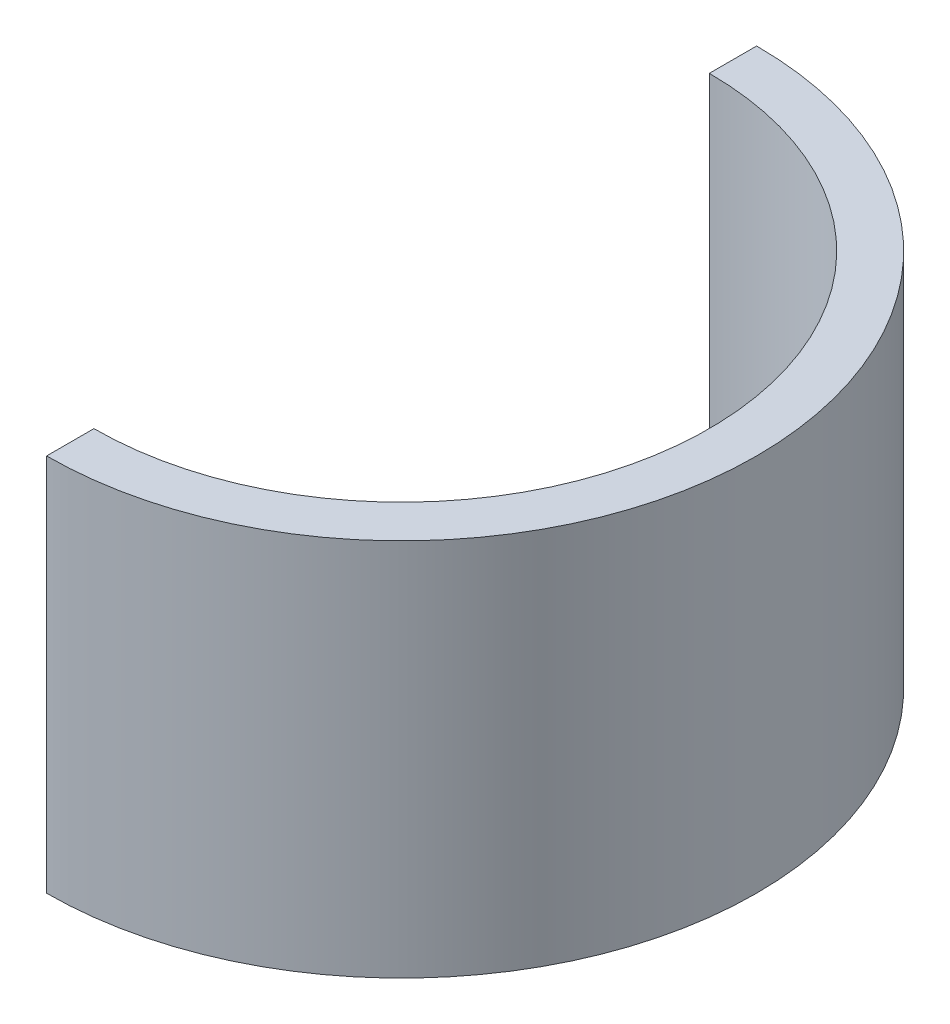
ISO-10303-21;
HEADER;
FILE_DESCRIPTION(('STEP AP214'),'2;1');
FILE_NAME('part.step','',(''),(''),'','','');
FILE_SCHEMA(('AUTOMOTIVE_DESIGN { 1 0 10303 214 1 1 1 1 }'));
ENDSEC;
DATA;
#1=APPLICATION_CONTEXT('core data for automotive mechanical design processes');
#2=APPLICATION_PROTOCOL_DEFINITION('international standard','automotive_design',2000,#1);
#3=PRODUCT_CONTEXT('',#1,'mechanical');
#4=PRODUCT('Part','Part','',(#3));
#5=PRODUCT_RELATED_PRODUCT_CATEGORY('part','',(#4));
#6=PRODUCT_DEFINITION_FORMATION('','',#4);
#7=PRODUCT_DEFINITION_CONTEXT('part definition',#1,'design');
#8=PRODUCT_DEFINITION('design','',#6,#7);
#9=PRODUCT_DEFINITION_SHAPE('','',#8);
#10=(LENGTH_UNIT() NAMED_UNIT(*) SI_UNIT(.MILLI.,.METRE.));
#11=(NAMED_UNIT(*) PLANE_ANGLE_UNIT() SI_UNIT($,.RADIAN.));
#12=(NAMED_UNIT(*) SI_UNIT($,.STERADIAN.) SOLID_ANGLE_UNIT());
#13=UNCERTAINTY_MEASURE_WITH_UNIT(LENGTH_MEASURE(1.E-05),#10,'distance_accuracy_value','');
#14=(GEOMETRIC_REPRESENTATION_CONTEXT(3) GLOBAL_UNCERTAINTY_ASSIGNED_CONTEXT((#13)) GLOBAL_UNIT_ASSIGNED_CONTEXT((#10,
#11,#12)) REPRESENTATION_CONTEXT('',''));
#15=CARTESIAN_POINT('',(0.,0.,0.));
#16=DIRECTION('',(0.,0.,1.));
#17=DIRECTION('',(1.,0.,0.));
#18=AXIS2_PLACEMENT_3D('',#15,#16,#17);
#19=CARTESIAN_POINT('',(0.,8.,0.));
#20=DIRECTION('',(0.,-1.,0.));
#21=DIRECTION('',(0.,0.,-1.));
#22=AXIS2_PLACEMENT_3D('',#19,#20,#21);
#23=CYLINDRICAL_SURFACE('',#22,7.5);
#24=CARTESIAN_POINT('',(0.,0.,0.));
#25=DIRECTION('',(0.,1.,0.));
#26=DIRECTION('',(0.,0.,1.));
#27=AXIS2_PLACEMENT_3D('',#24,#25,#26);
#28=CIRCLE('',#27,7.5);
#29=CARTESIAN_POINT('',(0.,0.,7.5));
#30=VERTEX_POINT('',#29);
#31=CARTESIAN_POINT('',(0.,0.,-7.5));
#32=VERTEX_POINT('',#31);
#33=EDGE_CURVE('E113',#30,#32,#28,.T.);
#34=ORIENTED_EDGE('',*,*,#33,.T.);
#35=DIRECTION('',(0.,-1.,0.));
#36=VECTOR('',#35,1.);
#37=CARTESIAN_POINT('',(0.,8.,-7.5));
#38=LINE('',#37,#36);
#39=CARTESIAN_POINT('',(0.,8.,-7.5));
#40=VERTEX_POINT('',#39);
#41=EDGE_CURVE('E11',#40,#32,#38,.T.);
#42=ORIENTED_EDGE('',*,*,#41,.F.);
#43=CARTESIAN_POINT('',(0.,8.,0.));
#44=DIRECTION('',(0.,1.,0.));
#45=DIRECTION('',(0.,0.,1.));
#46=AXIS2_PLACEMENT_3D('',#43,#44,#45);
#47=CIRCLE('',#46,7.5);
#48=CARTESIAN_POINT('',(0.,8.,7.5));
#49=VERTEX_POINT('',#48);
#50=EDGE_CURVE('E97',#49,#40,#47,.T.);
#51=ORIENTED_EDGE('',*,*,#50,.F.);
#52=DIRECTION('',(0.,-1.,0.));
#53=VECTOR('',#52,1.);
#54=CARTESIAN_POINT('',(0.,8.,7.5));
#55=LINE('',#54,#53);
#56=EDGE_CURVE('E109',#49,#30,#55,.T.);
#57=ORIENTED_EDGE('',*,*,#56,.T.);
#58=EDGE_LOOP('',(#34,#42,#51,#57));
#59=FACE_BOUND('',#58,.T.);
#60=ADVANCED_FACE('F45',(#59),#23,.T.);
#61=CARTESIAN_POINT('',(0.,8.,-7.5));
#62=DIRECTION('',(1.,0.,0.));
#63=DIRECTION('',(0.,0.,-1.));
#64=AXIS2_PLACEMENT_3D('',#61,#62,#63);
#65=PLANE('',#64);
#66=DIRECTION('',(0.,0.,1.));
#67=VECTOR('',#66,1.);
#68=CARTESIAN_POINT('',(0.,0.,-7.5));
#69=LINE('',#68,#67);
#70=CARTESIAN_POINT('',(0.,0.,-6.5));
#71=VERTEX_POINT('',#70);
#72=EDGE_CURVE('E102',#32,#71,#69,.T.);
#73=ORIENTED_EDGE('',*,*,#72,.T.);
#74=DIRECTION('',(0.,-1.,0.));
#75=VECTOR('',#74,1.);
#76=CARTESIAN_POINT('',(0.,8.,-6.5));
#77=LINE('',#76,#75);
#78=CARTESIAN_POINT('',(0.,8.,-6.5));
#79=VERTEX_POINT('',#78);
#80=EDGE_CURVE('E54',#79,#71,#77,.T.);
#81=ORIENTED_EDGE('',*,*,#80,.F.);
#82=DIRECTION('',(0.,0.,1.));
#83=VECTOR('',#82,1.);
#84=CARTESIAN_POINT('',(0.,8.,-7.5));
#85=LINE('',#84,#83);
#86=EDGE_CURVE('E92',#40,#79,#85,.T.);
#87=ORIENTED_EDGE('',*,*,#86,.F.);
#88=ORIENTED_EDGE('',*,*,#41,.T.);
#89=EDGE_LOOP('',(#73,#81,#87,#88));
#90=FACE_BOUND('',#89,.T.);
#91=ADVANCED_FACE('F101',(#90),#65,.F.);
#92=CARTESIAN_POINT('',(0.,8.,0.));
#93=DIRECTION('',(0.,-1.,0.));
#94=DIRECTION('',(0.,0.,-1.));
#95=AXIS2_PLACEMENT_3D('',#92,#93,#94);
#96=CYLINDRICAL_SURFACE('',#95,6.5);
#97=CARTESIAN_POINT('',(0.,0.,0.));
#98=DIRECTION('',(0.,-1.,0.));
#99=DIRECTION('',(0.,0.,1.));
#100=AXIS2_PLACEMENT_3D('',#97,#98,#99);
#101=CIRCLE('',#100,6.5);
#102=CARTESIAN_POINT('',(0.,0.,6.5));
#103=VERTEX_POINT('',#102);
#104=EDGE_CURVE('E79',#71,#103,#101,.T.);
#105=ORIENTED_EDGE('',*,*,#104,.T.);
#106=DIRECTION('',(0.,-1.,0.));
#107=VECTOR('',#106,1.);
#108=CARTESIAN_POINT('',(0.,8.,6.5));
#109=LINE('',#108,#107);
#110=CARTESIAN_POINT('',(0.,8.,6.5));
#111=VERTEX_POINT('',#110);
#112=EDGE_CURVE('E104',#111,#103,#109,.T.);
#113=ORIENTED_EDGE('',*,*,#112,.F.);
#114=CARTESIAN_POINT('',(0.,8.,0.));
#115=DIRECTION('',(0.,-1.,0.));
#116=DIRECTION('',(0.,0.,1.));
#117=AXIS2_PLACEMENT_3D('',#114,#115,#116);
#118=CIRCLE('',#117,6.5);
#119=EDGE_CURVE('E95',#79,#111,#118,.T.);
#120=ORIENTED_EDGE('',*,*,#119,.F.);
#121=ORIENTED_EDGE('',*,*,#80,.T.);
#122=EDGE_LOOP('',(#105,#113,#120,#121));
#123=FACE_BOUND('',#122,.T.);
#124=ADVANCED_FACE('F105',(#123),#96,.F.);
#125=CARTESIAN_POINT('',(0.,8.,6.5));
#126=DIRECTION('',(1.,0.,0.));
#127=DIRECTION('',(0.,0.,-1.));
#128=AXIS2_PLACEMENT_3D('',#125,#126,#127);
#129=PLANE('',#128);
#130=DIRECTION('',(0.,0.,1.));
#131=VECTOR('',#130,1.);
#132=CARTESIAN_POINT('',(0.,0.,6.5));
#133=LINE('',#132,#131);
#134=EDGE_CURVE('E85',#103,#30,#133,.T.);
#135=ORIENTED_EDGE('',*,*,#134,.T.);
#136=ORIENTED_EDGE('',*,*,#56,.F.);
#137=DIRECTION('',(0.,0.,1.));
#138=VECTOR('',#137,1.);
#139=CARTESIAN_POINT('',(0.,8.,6.5));
#140=LINE('',#139,#138);
#141=EDGE_CURVE('E62',#111,#49,#140,.T.);
#142=ORIENTED_EDGE('',*,*,#141,.F.);
#143=ORIENTED_EDGE('',*,*,#112,.T.);
#144=EDGE_LOOP('',(#135,#136,#142,#143));
#145=FACE_BOUND('',#144,.T.);
#146=ADVANCED_FACE('F126',(#145),#129,.F.);
#147=CARTESIAN_POINT('',(0.,8.,0.));
#148=DIRECTION('',(0.,1.,0.));
#149=DIRECTION('',(0.,0.,1.));
#150=AXIS2_PLACEMENT_3D('',#147,#148,#149);
#151=PLANE('',#150);
#152=ORIENTED_EDGE('',*,*,#50,.T.);
#153=ORIENTED_EDGE('',*,*,#86,.T.);
#154=ORIENTED_EDGE('',*,*,#119,.T.);
#155=ORIENTED_EDGE('',*,*,#141,.T.);
#156=EDGE_LOOP('',(#152,#153,#154,#155));
#157=FACE_BOUND('',#156,.T.);
#158=ADVANCED_FACE('F93',(#157),#151,.T.);
#159=CARTESIAN_POINT('',(0.,0.,0.));
#160=DIRECTION('',(0.,1.,0.));
#161=DIRECTION('',(0.,0.,1.));
#162=AXIS2_PLACEMENT_3D('',#159,#160,#161);
#163=PLANE('',#162);
#164=ORIENTED_EDGE('',*,*,#33,.F.);
#165=ORIENTED_EDGE('',*,*,#134,.F.);
#166=ORIENTED_EDGE('',*,*,#104,.F.);
#167=ORIENTED_EDGE('',*,*,#72,.F.);
#168=EDGE_LOOP('',(#164,#165,#166,#167));
#169=FACE_BOUND('',#168,.T.);
#170=ADVANCED_FACE('F129',(#169),#163,.F.);
#171=CLOSED_SHELL('',(#60,#91,#124,#146,#158,#170));
#172=MANIFOLD_SOLID_BREP('B2',#171);
#173=ADVANCED_BREP_SHAPE_REPRESENTATION('',(#18,#172),#14);
#174=SHAPE_DEFINITION_REPRESENTATION(#9,#173);
ENDSEC;
END-ISO-10303-21;
